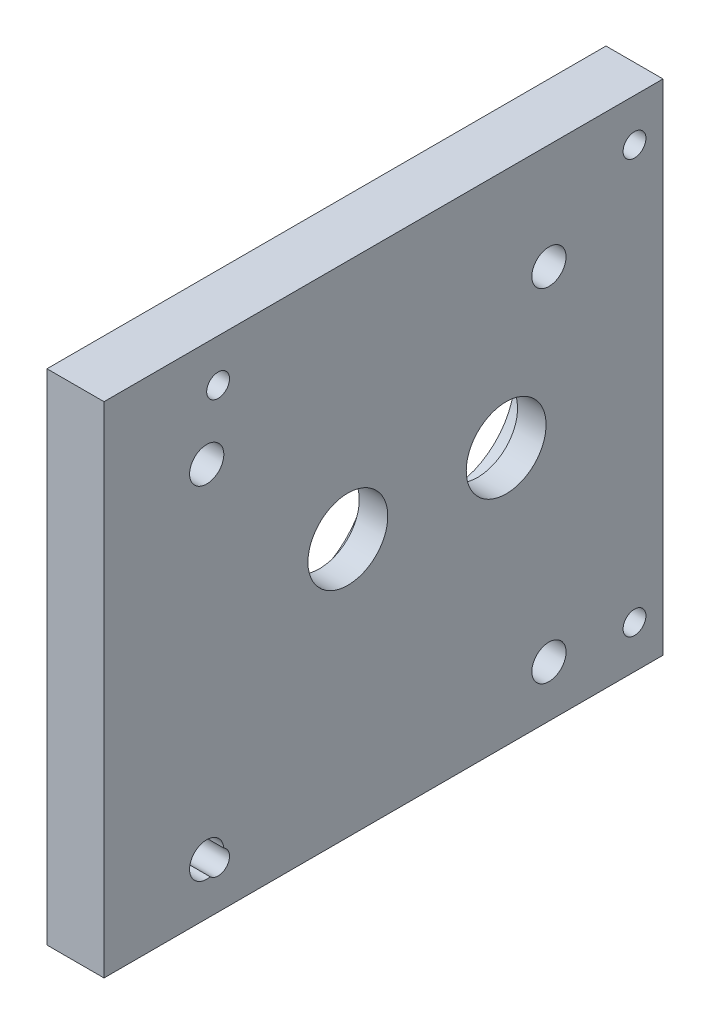
ISO-10303-21;
HEADER;
FILE_DESCRIPTION(('STEP AP214'),'2;1');
FILE_NAME('part.step','',(''),(''),'','','');
FILE_SCHEMA(('AUTOMOTIVE_DESIGN { 1 0 10303 214 1 1 1 1 }'));
ENDSEC;
DATA;
#1=APPLICATION_CONTEXT('core data for automotive mechanical design processes');
#2=APPLICATION_PROTOCOL_DEFINITION('international standard','automotive_design',2000,#1);
#3=PRODUCT_CONTEXT('',#1,'mechanical');
#4=PRODUCT('Part','Part','',(#3));
#5=PRODUCT_RELATED_PRODUCT_CATEGORY('part','',(#4));
#6=PRODUCT_DEFINITION_FORMATION('','',#4);
#7=PRODUCT_DEFINITION_CONTEXT('part definition',#1,'design');
#8=PRODUCT_DEFINITION('design','',#6,#7);
#9=PRODUCT_DEFINITION_SHAPE('','',#8);
#10=(LENGTH_UNIT() NAMED_UNIT(*) SI_UNIT(.MILLI.,.METRE.));
#11=(NAMED_UNIT(*) PLANE_ANGLE_UNIT() SI_UNIT($,.RADIAN.));
#12=(NAMED_UNIT(*) SI_UNIT($,.STERADIAN.) SOLID_ANGLE_UNIT());
#13=UNCERTAINTY_MEASURE_WITH_UNIT(LENGTH_MEASURE(1.E-05),#10,'distance_accuracy_value','');
#14=(GEOMETRIC_REPRESENTATION_CONTEXT(3) GLOBAL_UNCERTAINTY_ASSIGNED_CONTEXT((#13)) GLOBAL_UNIT_ASSIGNED_CONTEXT((#10,
#11,#12)) REPRESENTATION_CONTEXT('',''));
#15=CARTESIAN_POINT('',(0.,0.,0.));
#16=DIRECTION('',(0.,0.,1.));
#17=DIRECTION('',(1.,0.,0.));
#18=AXIS2_PLACEMENT_3D('',#15,#16,#17);
#19=CARTESIAN_POINT('',(-10.,175.,-98.));
#20=DIRECTION('',(1.,0.,0.));
#21=DIRECTION('',(0.,0.,-1.));
#22=AXIS2_PLACEMENT_3D('',#19,#20,#21);
#23=PLANE('',#22);
#24=CARTESIAN_POINT('',(-10.,138.,-58.));
#25=DIRECTION('',(-1.,0.,0.));
#26=DIRECTION('',(0.,0.,-1.));
#27=AXIS2_PLACEMENT_3D('',#24,#25,#26);
#28=CIRCLE('',#27,6.);
#29=CARTESIAN_POINT('',(-10.,138.,-64.));
#30=VERTEX_POINT('',#29);
#31=EDGE_CURVE('E219',#30,#30,#28,.T.);
#32=ORIENTED_EDGE('',*,*,#31,.F.);
#33=EDGE_LOOP('',(#32));
#34=FACE_BOUND('',#33,.T.);
#35=CARTESIAN_POINT('',(-10.,18.,-57.9999999999999));
#36=DIRECTION('',(-1.,0.,0.));
#37=DIRECTION('',(0.,0.,1.));
#38=AXIS2_PLACEMENT_3D('',#35,#36,#37);
#39=CIRCLE('',#38,6.);
#40=CARTESIAN_POINT('',(-10.,18.,-51.9999999999999));
#41=VERTEX_POINT('',#40);
#42=EDGE_CURVE('E223',#41,#41,#39,.T.);
#43=ORIENTED_EDGE('',*,*,#42,.F.);
#44=EDGE_LOOP('',(#43));
#45=FACE_BOUND('',#44,.T.);
#46=CARTESIAN_POINT('',(-10.,138.,62.));
#47=DIRECTION('',(-1.,0.,0.));
#48=DIRECTION('',(0.,0.,1.));
#49=AXIS2_PLACEMENT_3D('',#46,#47,#48);
#50=CIRCLE('',#49,6.);
#51=CARTESIAN_POINT('',(-10.,138.,68.));
#52=VERTEX_POINT('',#51);
#53=EDGE_CURVE('E227',#52,#52,#50,.T.);
#54=ORIENTED_EDGE('',*,*,#53,.F.);
#55=EDGE_LOOP('',(#54));
#56=FACE_BOUND('',#55,.T.);
#57=CARTESIAN_POINT('',(-10.,160.,58.0000000000001));
#58=DIRECTION('',(-1.,0.,0.));
#59=DIRECTION('',(0.,0.,1.));
#60=AXIS2_PLACEMENT_3D('',#57,#58,#59);
#61=CIRCLE('',#60,4.00000000000001);
#62=CARTESIAN_POINT('',(-10.,160.,62.0000000000001));
#63=VERTEX_POINT('',#62);
#64=EDGE_CURVE('E231',#63,#63,#61,.T.);
#65=ORIENTED_EDGE('',*,*,#64,.F.);
#66=EDGE_LOOP('',(#65));
#67=FACE_BOUND('',#66,.T.);
#68=CARTESIAN_POINT('',(-10.,160.,-88.));
#69=DIRECTION('',(-1.,0.,0.));
#70=DIRECTION('',(0.,0.,1.));
#71=AXIS2_PLACEMENT_3D('',#68,#69,#70);
#72=CIRCLE('',#71,4.00000000000001);
#73=CARTESIAN_POINT('',(-10.,160.,-83.9999999999999));
#74=VERTEX_POINT('',#73);
#75=EDGE_CURVE('E235',#74,#74,#72,.T.);
#76=ORIENTED_EDGE('',*,*,#75,.F.);
#77=EDGE_LOOP('',(#76));
#78=FACE_BOUND('',#77,.T.);
#79=CARTESIAN_POINT('',(-10.,15.,-88.));
#80=DIRECTION('',(-1.,0.,0.));
#81=DIRECTION('',(0.,0.,1.));
#82=AXIS2_PLACEMENT_3D('',#79,#80,#81);
#83=CIRCLE('',#82,4.00000000000001);
#84=CARTESIAN_POINT('',(-10.,15.,-83.9999999999999));
#85=VERTEX_POINT('',#84);
#86=EDGE_CURVE('E117',#85,#85,#83,.T.);
#87=ORIENTED_EDGE('',*,*,#86,.F.);
#88=EDGE_LOOP('',(#87));
#89=FACE_BOUND('',#88,.T.);
#90=CARTESIAN_POINT('',(-10.,15.,58.0000000000001));
#91=DIRECTION('',(-1.,0.,0.));
#92=DIRECTION('',(0.,0.,1.));
#93=AXIS2_PLACEMENT_3D('',#90,#91,#92);
#94=CIRCLE('',#93,4.00000000000001);
#95=CARTESIAN_POINT('',(-10.,18.4749015732775,56.0188238200419));
#96=VERTEX_POINT('',#95);
#97=CARTESIAN_POINT('',(-10.,12.1250984267225,60.7811761799582));
#98=VERTEX_POINT('',#97);
#99=EDGE_CURVE('E107',#96,#98,#94,.T.);
#100=ORIENTED_EDGE('',*,*,#99,.F.);
#101=CARTESIAN_POINT('',(-10.,18.,62.));
#102=DIRECTION('',(-1.,0.,0.));
#103=DIRECTION('',(0.,0.,-1.));
#104=AXIS2_PLACEMENT_3D('',#101,#102,#103);
#105=CIRCLE('',#104,6.);
#106=EDGE_CURVE('E98',#98,#96,#105,.T.);
#107=ORIENTED_EDGE('',*,*,#106,.F.);
#108=EDGE_LOOP('',(#100,#107));
#109=FACE_BOUND('',#108,.T.);
#110=CARTESIAN_POINT('',(-10.,90.5,12.5));
#111=DIRECTION('',(-1.,0.,0.));
#112=DIRECTION('',(0.,0.,1.));
#113=AXIS2_PLACEMENT_3D('',#110,#111,#112);
#114=CIRCLE('',#113,27.5);
#115=CARTESIAN_POINT('',(-10.,90.5,40.));
#116=VERTEX_POINT('',#115);
#117=EDGE_CURVE('E142',#116,#116,#114,.T.);
#118=ORIENTED_EDGE('',*,*,#117,.F.);
#119=EDGE_LOOP('',(#118));
#120=FACE_BOUND('',#119,.T.);
#121=CARTESIAN_POINT('',(-10.,90.5,-43.));
#122=DIRECTION('',(-1.,0.,0.));
#123=DIRECTION('',(0.,0.,1.));
#124=AXIS2_PLACEMENT_3D('',#121,#122,#123);
#125=CIRCLE('',#124,23.);
#126=CARTESIAN_POINT('',(-10.,90.5,-20.));
#127=VERTEX_POINT('',#126);
#128=EDGE_CURVE('E125',#127,#127,#125,.T.);
#129=ORIENTED_EDGE('',*,*,#128,.F.);
#130=EDGE_LOOP('',(#129));
#131=FACE_BOUND('',#130,.T.);
#132=DIRECTION('',(0.,0.,1.));
#133=VECTOR('',#132,1.);
#134=CARTESIAN_POINT('',(-10.,0.,-98.));
#135=LINE('',#134,#133);
#136=CARTESIAN_POINT('',(-10.,0.,-98.));
#137=VERTEX_POINT('',#136);
#138=CARTESIAN_POINT('',(-10.,0.,98.));
#139=VERTEX_POINT('',#138);
#140=EDGE_CURVE('E141',#137,#139,#135,.T.);
#141=ORIENTED_EDGE('',*,*,#140,.T.);
#142=DIRECTION('',(0.,-1.,0.));
#143=VECTOR('',#142,1.);
#144=CARTESIAN_POINT('',(-10.,175.,98.));
#145=LINE('',#144,#143);
#146=CARTESIAN_POINT('',(-10.,175.,98.));
#147=VERTEX_POINT('',#146);
#148=EDGE_CURVE('E103',#147,#139,#145,.T.);
#149=ORIENTED_EDGE('',*,*,#148,.F.);
#150=DIRECTION('',(0.,0.,1.));
#151=VECTOR('',#150,1.);
#152=CARTESIAN_POINT('',(-10.,175.,-98.));
#153=LINE('',#152,#151);
#154=CARTESIAN_POINT('',(-10.,175.,-98.));
#155=VERTEX_POINT('',#154);
#156=EDGE_CURVE('E153',#155,#147,#153,.T.);
#157=ORIENTED_EDGE('',*,*,#156,.F.);
#158=DIRECTION('',(0.,-1.,0.));
#159=VECTOR('',#158,1.);
#160=CARTESIAN_POINT('',(-10.,175.,-98.));
#161=LINE('',#160,#159);
#162=EDGE_CURVE('E163',#155,#137,#161,.T.);
#163=ORIENTED_EDGE('',*,*,#162,.T.);
#164=EDGE_LOOP('',(#141,#149,#157,#163));
#165=FACE_BOUND('',#164,.T.);
#166=ADVANCED_FACE('F37',(#34,#45,#56,#67,#78,#89,#109,#120,#131,#165),#23,.F.);
#167=CARTESIAN_POINT('',(-10.,175.,98.));
#168=DIRECTION('',(0.,0.,-1.));
#169=DIRECTION('',(-1.,0.,0.));
#170=AXIS2_PLACEMENT_3D('',#167,#168,#169);
#171=PLANE('',#170);
#172=DIRECTION('',(1.,0.,0.));
#173=VECTOR('',#172,1.);
#174=CARTESIAN_POINT('',(-10.,0.,98.));
#175=LINE('',#174,#173);
#176=CARTESIAN_POINT('',(10.,0.,98.));
#177=VERTEX_POINT('',#176);
#178=EDGE_CURVE('E167',#139,#177,#175,.T.);
#179=ORIENTED_EDGE('',*,*,#178,.T.);
#180=DIRECTION('',(0.,-1.,0.));
#181=VECTOR('',#180,1.);
#182=CARTESIAN_POINT('',(10.,175.,98.));
#183=LINE('',#182,#181);
#184=CARTESIAN_POINT('',(10.,175.,98.));
#185=VERTEX_POINT('',#184);
#186=EDGE_CURVE('E180',#185,#177,#183,.T.);
#187=ORIENTED_EDGE('',*,*,#186,.F.);
#188=DIRECTION('',(1.,0.,0.));
#189=VECTOR('',#188,1.);
#190=CARTESIAN_POINT('',(-10.,175.,98.));
#191=LINE('',#190,#189);
#192=EDGE_CURVE('E89',#147,#185,#191,.T.);
#193=ORIENTED_EDGE('',*,*,#192,.F.);
#194=ORIENTED_EDGE('',*,*,#148,.T.);
#195=EDGE_LOOP('',(#179,#187,#193,#194));
#196=FACE_BOUND('',#195,.T.);
#197=ADVANCED_FACE('F186',(#196),#171,.F.);
#198=CARTESIAN_POINT('',(9.99999999999998,175.,-98.));
#199=DIRECTION('',(-1.,0.,0.));
#200=DIRECTION('',(0.,0.,1.));
#201=AXIS2_PLACEMENT_3D('',#198,#199,#200);
#202=PLANE('',#201);
#203=CARTESIAN_POINT('',(10.0000000000001,138.,-58.));
#204=DIRECTION('',(-1.,0.,0.));
#205=DIRECTION('',(0.,0.,-1.));
#206=AXIS2_PLACEMENT_3D('',#203,#204,#205);
#207=CIRCLE('',#206,6.);
#208=CARTESIAN_POINT('',(10.0000000000001,138.,-64.));
#209=VERTEX_POINT('',#208);
#210=EDGE_CURVE('E108',#209,#209,#207,.T.);
#211=ORIENTED_EDGE('',*,*,#210,.T.);
#212=EDGE_LOOP('',(#211));
#213=FACE_BOUND('',#212,.T.);
#214=CARTESIAN_POINT('',(10.0000000000001,18.,-57.9999999999999));
#215=DIRECTION('',(-1.,0.,0.));
#216=DIRECTION('',(0.,0.,1.));
#217=AXIS2_PLACEMENT_3D('',#214,#215,#216);
#218=CIRCLE('',#217,6.);
#219=CARTESIAN_POINT('',(10.0000000000001,18.,-51.9999999999999));
#220=VERTEX_POINT('',#219);
#221=EDGE_CURVE('E256',#220,#220,#218,.T.);
#222=ORIENTED_EDGE('',*,*,#221,.T.);
#223=EDGE_LOOP('',(#222));
#224=FACE_BOUND('',#223,.T.);
#225=CARTESIAN_POINT('',(10.0000000000001,138.,62.));
#226=DIRECTION('',(-1.,0.,0.));
#227=DIRECTION('',(0.,0.,1.));
#228=AXIS2_PLACEMENT_3D('',#225,#226,#227);
#229=CIRCLE('',#228,6.);
#230=CARTESIAN_POINT('',(10.0000000000001,138.,68.));
#231=VERTEX_POINT('',#230);
#232=EDGE_CURVE('E248',#231,#231,#229,.T.);
#233=ORIENTED_EDGE('',*,*,#232,.T.);
#234=EDGE_LOOP('',(#233));
#235=FACE_BOUND('',#234,.T.);
#236=CARTESIAN_POINT('',(10.0000000000001,160.,58.));
#237=DIRECTION('',(-1.,0.,0.));
#238=DIRECTION('',(0.,0.,1.));
#239=AXIS2_PLACEMENT_3D('',#236,#237,#238);
#240=CIRCLE('',#239,4.00000000000001);
#241=CARTESIAN_POINT('',(10.0000000000001,160.,62.0000000000001));
#242=VERTEX_POINT('',#241);
#243=EDGE_CURVE('E246',#242,#242,#240,.T.);
#244=ORIENTED_EDGE('',*,*,#243,.T.);
#245=EDGE_LOOP('',(#244));
#246=FACE_BOUND('',#245,.T.);
#247=CARTESIAN_POINT('',(10.0000000000001,160.,-88.));
#248=DIRECTION('',(-1.,0.,0.));
#249=DIRECTION('',(0.,0.,1.));
#250=AXIS2_PLACEMENT_3D('',#247,#248,#249);
#251=CIRCLE('',#250,4.00000000000001);
#252=CARTESIAN_POINT('',(10.0000000000001,160.,-83.9999999999999));
#253=VERTEX_POINT('',#252);
#254=EDGE_CURVE('E239',#253,#253,#251,.T.);
#255=ORIENTED_EDGE('',*,*,#254,.T.);
#256=EDGE_LOOP('',(#255));
#257=FACE_BOUND('',#256,.T.);
#258=CARTESIAN_POINT('',(10.0000000000001,15.,-88.));
#259=DIRECTION('',(-1.,0.,0.));
#260=DIRECTION('',(0.,0.,1.));
#261=AXIS2_PLACEMENT_3D('',#258,#259,#260);
#262=CIRCLE('',#261,4.00000000000001);
#263=CARTESIAN_POINT('',(10.0000000000001,15.,-83.9999999999999));
#264=VERTEX_POINT('',#263);
#265=EDGE_CURVE('E112',#264,#264,#262,.T.);
#266=ORIENTED_EDGE('',*,*,#265,.T.);
#267=EDGE_LOOP('',(#266));
#268=FACE_BOUND('',#267,.T.);
#269=CARTESIAN_POINT('',(10.0000000000001,15.,58.));
#270=DIRECTION('',(-1.,0.,0.));
#271=DIRECTION('',(0.,0.,1.));
#272=AXIS2_PLACEMENT_3D('',#269,#270,#271);
#273=CIRCLE('',#272,4.00000000000001);
#274=CARTESIAN_POINT('',(10.0000000000001,18.4749015732775,56.0188238200419));
#275=VERTEX_POINT('',#274);
#276=CARTESIAN_POINT('',(10.0000000000001,12.1250984267225,60.7811761799582));
#277=VERTEX_POINT('',#276);
#278=EDGE_CURVE('E111',#275,#277,#273,.T.);
#279=ORIENTED_EDGE('',*,*,#278,.T.);
#280=CARTESIAN_POINT('',(10.0000000000001,18.,62.));
#281=DIRECTION('',(-1.,0.,0.));
#282=DIRECTION('',(0.,0.,-1.));
#283=AXIS2_PLACEMENT_3D('',#280,#281,#282);
#284=CIRCLE('',#283,6.);
#285=EDGE_CURVE('E51',#277,#275,#284,.T.);
#286=ORIENTED_EDGE('',*,*,#285,.T.);
#287=EDGE_LOOP('',(#279,#286));
#288=FACE_BOUND('',#287,.T.);
#289=CARTESIAN_POINT('',(10.,90.5,12.5));
#290=DIRECTION('',(-1.,0.,0.));
#291=DIRECTION('',(0.,0.,1.));
#292=AXIS2_PLACEMENT_3D('',#289,#290,#291);
#293=CIRCLE('',#292,14.);
#294=CARTESIAN_POINT('',(10.0000000000001,90.5,26.5));
#295=VERTEX_POINT('',#294);
#296=EDGE_CURVE('E121',#295,#295,#293,.T.);
#297=ORIENTED_EDGE('',*,*,#296,.T.);
#298=EDGE_LOOP('',(#297));
#299=FACE_BOUND('',#298,.T.);
#300=CARTESIAN_POINT('',(10.,90.5,-43.));
#301=DIRECTION('',(-1.,0.,0.));
#302=DIRECTION('',(0.,0.,1.));
#303=AXIS2_PLACEMENT_3D('',#300,#301,#302);
#304=CIRCLE('',#303,14.);
#305=CARTESIAN_POINT('',(10.,90.5,-29.));
#306=VERTEX_POINT('',#305);
#307=EDGE_CURVE('E130',#306,#306,#304,.T.);
#308=ORIENTED_EDGE('',*,*,#307,.T.);
#309=EDGE_LOOP('',(#308));
#310=FACE_BOUND('',#309,.T.);
#311=DIRECTION('',(0.,0.,-1.));
#312=VECTOR('',#311,1.);
#313=CARTESIAN_POINT('',(9.99999999999998,0.,-98.));
#314=LINE('',#313,#312);
#315=CARTESIAN_POINT('',(9.99999999999998,0.,-98.));
#316=VERTEX_POINT('',#315);
#317=EDGE_CURVE('E170',#177,#316,#314,.T.);
#318=ORIENTED_EDGE('',*,*,#317,.T.);
#319=DIRECTION('',(0.,-1.,0.));
#320=VECTOR('',#319,1.);
#321=CARTESIAN_POINT('',(9.99999999999998,175.,-98.));
#322=LINE('',#321,#320);
#323=CARTESIAN_POINT('',(9.99999999999998,175.,-98.));
#324=VERTEX_POINT('',#323);
#325=EDGE_CURVE('E177',#324,#316,#322,.T.);
#326=ORIENTED_EDGE('',*,*,#325,.F.);
#327=DIRECTION('',(0.,0.,-1.));
#328=VECTOR('',#327,1.);
#329=CARTESIAN_POINT('',(9.99999999999998,175.,-98.));
#330=LINE('',#329,#328);
#331=EDGE_CURVE('E158',#185,#324,#330,.T.);
#332=ORIENTED_EDGE('',*,*,#331,.F.);
#333=ORIENTED_EDGE('',*,*,#186,.T.);
#334=EDGE_LOOP('',(#318,#326,#332,#333));
#335=FACE_BOUND('',#334,.T.);
#336=ADVANCED_FACE('F195',(#213,#224,#235,#246,#257,#268,#288,#299,#310,#335),#202,.F.);
#337=CARTESIAN_POINT('',(-10.,175.,-98.));
#338=DIRECTION('',(0.,0.,1.));
#339=DIRECTION('',(1.,0.,0.));
#340=AXIS2_PLACEMENT_3D('',#337,#338,#339);
#341=PLANE('',#340);
#342=DIRECTION('',(-1.,0.,0.));
#343=VECTOR('',#342,1.);
#344=CARTESIAN_POINT('',(-10.,0.,-98.));
#345=LINE('',#344,#343);
#346=EDGE_CURVE('E81',#316,#137,#345,.T.);
#347=ORIENTED_EDGE('',*,*,#346,.T.);
#348=ORIENTED_EDGE('',*,*,#162,.F.);
#349=DIRECTION('',(-1.,0.,0.));
#350=VECTOR('',#349,1.);
#351=CARTESIAN_POINT('',(-10.,175.,-98.));
#352=LINE('',#351,#350);
#353=EDGE_CURVE('E60',#324,#155,#352,.T.);
#354=ORIENTED_EDGE('',*,*,#353,.F.);
#355=ORIENTED_EDGE('',*,*,#325,.T.);
#356=EDGE_LOOP('',(#347,#348,#354,#355));
#357=FACE_BOUND('',#356,.T.);
#358=ADVANCED_FACE('F197',(#357),#341,.F.);
#359=CARTESIAN_POINT('',(0.,175.,0.));
#360=DIRECTION('',(0.,1.,0.));
#361=DIRECTION('',(0.,0.,1.));
#362=AXIS2_PLACEMENT_3D('',#359,#360,#361);
#363=PLANE('',#362);
#364=ORIENTED_EDGE('',*,*,#156,.T.);
#365=ORIENTED_EDGE('',*,*,#192,.T.);
#366=ORIENTED_EDGE('',*,*,#331,.T.);
#367=ORIENTED_EDGE('',*,*,#353,.T.);
#368=EDGE_LOOP('',(#364,#365,#366,#367));
#369=FACE_BOUND('',#368,.T.);
#370=ADVANCED_FACE('F198',(#369),#363,.T.);
#371=CARTESIAN_POINT('',(0.,0.,0.));
#372=DIRECTION('',(0.,1.,0.));
#373=DIRECTION('',(0.,0.,1.));
#374=AXIS2_PLACEMENT_3D('',#371,#372,#373);
#375=PLANE('',#374);
#376=CARTESIAN_POINT('',(0.,0.,-65.));
#377=DIRECTION('',(0.,-1.,0.));
#378=DIRECTION('',(0.,0.,-1.));
#379=AXIS2_PLACEMENT_3D('',#376,#377,#378);
#380=CIRCLE('',#379,4.);
#381=CARTESIAN_POINT('',(0.,0.,-69.));
#382=VERTEX_POINT('',#381);
#383=EDGE_CURVE('E270',#382,#382,#380,.T.);
#384=ORIENTED_EDGE('',*,*,#383,.F.);
#385=EDGE_LOOP('',(#384));
#386=FACE_BOUND('',#385,.T.);
#387=CARTESIAN_POINT('',(0.,0.,35.));
#388=DIRECTION('',(0.,-1.,0.));
#389=DIRECTION('',(0.,0.,1.));
#390=AXIS2_PLACEMENT_3D('',#387,#388,#389);
#391=CIRCLE('',#390,4.);
#392=CARTESIAN_POINT('',(0.,0.,39.));
#393=VERTEX_POINT('',#392);
#394=EDGE_CURVE('E264',#393,#393,#391,.T.);
#395=ORIENTED_EDGE('',*,*,#394,.F.);
#396=EDGE_LOOP('',(#395));
#397=FACE_BOUND('',#396,.T.);
#398=ORIENTED_EDGE('',*,*,#140,.F.);
#399=ORIENTED_EDGE('',*,*,#346,.F.);
#400=ORIENTED_EDGE('',*,*,#317,.F.);
#401=ORIENTED_EDGE('',*,*,#178,.F.);
#402=EDGE_LOOP('',(#398,#399,#400,#401));
#403=FACE_BOUND('',#402,.T.);
#404=ADVANCED_FACE('F191',(#386,#397,#403),#375,.F.);
#405=CARTESIAN_POINT('',(0.,90.5,-43.));
#406=DIRECTION('',(-1.,0.,0.));
#407=DIRECTION('',(0.,0.,1.));
#408=AXIS2_PLACEMENT_3D('',#405,#406,#407);
#409=CYLINDRICAL_SURFACE('',#408,23.);
#410=CARTESIAN_POINT('',(0.,90.5,-43.));
#411=DIRECTION('',(-1.,0.,0.));
#412=DIRECTION('',(0.,0.,1.));
#413=AXIS2_PLACEMENT_3D('',#410,#411,#412);
#414=CIRCLE('',#413,23.);
#415=CARTESIAN_POINT('',(0.,90.5,-20.));
#416=VERTEX_POINT('',#415);
#417=EDGE_CURVE('E146',#416,#416,#414,.T.);
#418=ORIENTED_EDGE('',*,*,#417,.F.);
#419=EDGE_LOOP('',(#418));
#420=FACE_BOUND('',#419,.T.);
#421=ORIENTED_EDGE('',*,*,#128,.T.);
#422=EDGE_LOOP('',(#421));
#423=FACE_BOUND('',#422,.T.);
#424=ADVANCED_FACE('F206',(#420,#423),#409,.F.);
#425=CARTESIAN_POINT('',(0.,90.5,-43.));
#426=DIRECTION('',(-1.,0.,0.));
#427=DIRECTION('',(0.,0.,1.));
#428=AXIS2_PLACEMENT_3D('',#425,#426,#427);
#429=PLANE('',#428);
#430=CARTESIAN_POINT('',(0.,90.5,-43.));
#431=DIRECTION('',(-1.,0.,0.));
#432=DIRECTION('',(0.,0.,1.));
#433=AXIS2_PLACEMENT_3D('',#430,#431,#432);
#434=CIRCLE('',#433,14.);
#435=CARTESIAN_POINT('',(0.,90.5,-29.));
#436=VERTEX_POINT('',#435);
#437=EDGE_CURVE('E114',#436,#436,#434,.T.);
#438=ORIENTED_EDGE('',*,*,#437,.F.);
#439=EDGE_LOOP('',(#438));
#440=FACE_BOUND('',#439,.T.);
#441=ORIENTED_EDGE('',*,*,#417,.T.);
#442=EDGE_LOOP('',(#441));
#443=FACE_BOUND('',#442,.T.);
#444=ADVANCED_FACE('F341',(#440,#443),#429,.T.);
#445=CARTESIAN_POINT('',(0.,90.5,12.5));
#446=DIRECTION('',(-1.,0.,0.));
#447=DIRECTION('',(0.,0.,1.));
#448=AXIS2_PLACEMENT_3D('',#445,#446,#447);
#449=CYLINDRICAL_SURFACE('',#448,27.5);
#450=CARTESIAN_POINT('',(0.,90.5,12.5));
#451=DIRECTION('',(-1.,0.,0.));
#452=DIRECTION('',(0.,0.,1.));
#453=AXIS2_PLACEMENT_3D('',#450,#451,#452);
#454=CIRCLE('',#453,27.5);
#455=CARTESIAN_POINT('',(0.,90.5,40.));
#456=VERTEX_POINT('',#455);
#457=EDGE_CURVE('E137',#456,#456,#454,.T.);
#458=ORIENTED_EDGE('',*,*,#457,.F.);
#459=EDGE_LOOP('',(#458));
#460=FACE_BOUND('',#459,.T.);
#461=ORIENTED_EDGE('',*,*,#117,.T.);
#462=EDGE_LOOP('',(#461));
#463=FACE_BOUND('',#462,.T.);
#464=ADVANCED_FACE('F337',(#460,#463),#449,.F.);
#465=CARTESIAN_POINT('',(0.,90.5,12.5));
#466=DIRECTION('',(-1.,0.,0.));
#467=DIRECTION('',(0.,0.,1.));
#468=AXIS2_PLACEMENT_3D('',#465,#466,#467);
#469=PLANE('',#468);
#470=CARTESIAN_POINT('',(0.,90.5,12.5));
#471=DIRECTION('',(-1.,0.,0.));
#472=DIRECTION('',(0.,0.,1.));
#473=AXIS2_PLACEMENT_3D('',#470,#471,#472);
#474=CIRCLE('',#473,14.);
#475=CARTESIAN_POINT('',(0.,90.5,26.5));
#476=VERTEX_POINT('',#475);
#477=EDGE_CURVE('E126',#476,#476,#474,.T.);
#478=ORIENTED_EDGE('',*,*,#477,.F.);
#479=EDGE_LOOP('',(#478));
#480=FACE_BOUND('',#479,.T.);
#481=ORIENTED_EDGE('',*,*,#457,.T.);
#482=EDGE_LOOP('',(#481));
#483=FACE_BOUND('',#482,.T.);
#484=ADVANCED_FACE('F333',(#480,#483),#469,.T.);
#485=CARTESIAN_POINT('',(10.,90.5,-43.));
#486=DIRECTION('',(-1.,0.,0.));
#487=DIRECTION('',(0.,0.,1.));
#488=AXIS2_PLACEMENT_3D('',#485,#486,#487);
#489=CYLINDRICAL_SURFACE('',#488,14.);
#490=ORIENTED_EDGE('',*,*,#307,.F.);
#491=EDGE_LOOP('',(#490));
#492=FACE_BOUND('',#491,.T.);
#493=ORIENTED_EDGE('',*,*,#437,.T.);
#494=EDGE_LOOP('',(#493));
#495=FACE_BOUND('',#494,.T.);
#496=ADVANCED_FACE('F329',(#492,#495),#489,.F.);
#497=CARTESIAN_POINT('',(10.,90.5,12.5));
#498=DIRECTION('',(-1.,0.,0.));
#499=DIRECTION('',(0.,0.,1.));
#500=AXIS2_PLACEMENT_3D('',#497,#498,#499);
#501=CYLINDRICAL_SURFACE('',#500,14.);
#502=ORIENTED_EDGE('',*,*,#296,.F.);
#503=EDGE_LOOP('',(#502));
#504=FACE_BOUND('',#503,.T.);
#505=ORIENTED_EDGE('',*,*,#477,.T.);
#506=EDGE_LOOP('',(#505));
#507=FACE_BOUND('',#506,.T.);
#508=ADVANCED_FACE('F326',(#504,#507),#501,.F.);
#509=CARTESIAN_POINT('',(10.0000000000001,15.,58.));
#510=DIRECTION('',(-1.,0.,0.));
#511=DIRECTION('',(0.,0.,1.));
#512=AXIS2_PLACEMENT_3D('',#509,#510,#511);
#513=CYLINDRICAL_SURFACE('',#512,4.00000000000001);
#514=ORIENTED_EDGE('',*,*,#278,.F.);
#515=DIRECTION('',(-1.,0.,0.));
#516=VECTOR('',#515,1.);
#517=CARTESIAN_POINT('',(0.,18.4749015732775,56.0188238200419));
#518=LINE('',#517,#516);
#519=EDGE_CURVE('E11',#275,#96,#518,.T.);
#520=ORIENTED_EDGE('',*,*,#519,.T.);
#521=ORIENTED_EDGE('',*,*,#99,.T.);
#522=DIRECTION('',(-1.,0.,0.));
#523=VECTOR('',#522,1.);
#524=CARTESIAN_POINT('',(0.,12.1250984267225,60.7811761799582));
#525=LINE('',#524,#523);
#526=EDGE_CURVE('E44',#98,#277,#525,.F.);
#527=ORIENTED_EDGE('',*,*,#526,.T.);
#528=EDGE_LOOP('',(#514,#520,#521,#527));
#529=FACE_BOUND('',#528,.T.);
#530=ADVANCED_FACE('F110',(#529),#513,.F.);
#531=CARTESIAN_POINT('',(10.0000000000001,15.,-88.));
#532=DIRECTION('',(-1.,0.,0.));
#533=DIRECTION('',(0.,0.,1.));
#534=AXIS2_PLACEMENT_3D('',#531,#532,#533);
#535=CYLINDRICAL_SURFACE('',#534,4.00000000000001);
#536=ORIENTED_EDGE('',*,*,#265,.F.);
#537=EDGE_LOOP('',(#536));
#538=FACE_BOUND('',#537,.T.);
#539=ORIENTED_EDGE('',*,*,#86,.T.);
#540=EDGE_LOOP('',(#539));
#541=FACE_BOUND('',#540,.T.);
#542=ADVANCED_FACE('F313',(#538,#541),#535,.F.);
#543=CARTESIAN_POINT('',(10.0000000000001,160.,-88.));
#544=DIRECTION('',(-1.,0.,0.));
#545=DIRECTION('',(0.,0.,1.));
#546=AXIS2_PLACEMENT_3D('',#543,#544,#545);
#547=CYLINDRICAL_SURFACE('',#546,4.00000000000001);
#548=ORIENTED_EDGE('',*,*,#254,.F.);
#549=EDGE_LOOP('',(#548));
#550=FACE_BOUND('',#549,.T.);
#551=ORIENTED_EDGE('',*,*,#75,.T.);
#552=EDGE_LOOP('',(#551));
#553=FACE_BOUND('',#552,.T.);
#554=ADVANCED_FACE('F316',(#550,#553),#547,.F.);
#555=CARTESIAN_POINT('',(10.0000000000001,160.,58.));
#556=DIRECTION('',(-1.,0.,0.));
#557=DIRECTION('',(0.,0.,1.));
#558=AXIS2_PLACEMENT_3D('',#555,#556,#557);
#559=CYLINDRICAL_SURFACE('',#558,4.00000000000001);
#560=ORIENTED_EDGE('',*,*,#243,.F.);
#561=EDGE_LOOP('',(#560));
#562=FACE_BOUND('',#561,.T.);
#563=ORIENTED_EDGE('',*,*,#64,.T.);
#564=EDGE_LOOP('',(#563));
#565=FACE_BOUND('',#564,.T.);
#566=ADVANCED_FACE('F308',(#562,#565),#559,.F.);
#567=CARTESIAN_POINT('',(10.0000000000001,18.,62.));
#568=DIRECTION('',(-1.,0.,0.));
#569=DIRECTION('',(0.,0.,1.));
#570=AXIS2_PLACEMENT_3D('',#567,#568,#569);
#571=CYLINDRICAL_SURFACE('',#570,6.);
#572=ORIENTED_EDGE('',*,*,#285,.F.);
#573=ORIENTED_EDGE('',*,*,#526,.F.);
#574=ORIENTED_EDGE('',*,*,#106,.T.);
#575=ORIENTED_EDGE('',*,*,#519,.F.);
#576=EDGE_LOOP('',(#572,#573,#574,#575));
#577=FACE_BOUND('',#576,.T.);
#578=ADVANCED_FACE('F97',(#577),#571,.F.);
#579=CARTESIAN_POINT('',(10.0000000000001,138.,62.));
#580=DIRECTION('',(-1.,0.,0.));
#581=DIRECTION('',(0.,0.,1.));
#582=AXIS2_PLACEMENT_3D('',#579,#580,#581);
#583=CYLINDRICAL_SURFACE('',#582,6.);
#584=ORIENTED_EDGE('',*,*,#232,.F.);
#585=EDGE_LOOP('',(#584));
#586=FACE_BOUND('',#585,.T.);
#587=ORIENTED_EDGE('',*,*,#53,.T.);
#588=EDGE_LOOP('',(#587));
#589=FACE_BOUND('',#588,.T.);
#590=ADVANCED_FACE('F305',(#586,#589),#583,.F.);
#591=CARTESIAN_POINT('',(10.0000000000001,18.,-57.9999999999999));
#592=DIRECTION('',(-1.,0.,0.));
#593=DIRECTION('',(0.,0.,1.));
#594=AXIS2_PLACEMENT_3D('',#591,#592,#593);
#595=CYLINDRICAL_SURFACE('',#594,6.);
#596=ORIENTED_EDGE('',*,*,#221,.F.);
#597=EDGE_LOOP('',(#596));
#598=FACE_BOUND('',#597,.T.);
#599=ORIENTED_EDGE('',*,*,#42,.T.);
#600=EDGE_LOOP('',(#599));
#601=FACE_BOUND('',#600,.T.);
#602=ADVANCED_FACE('F298',(#598,#601),#595,.F.);
#603=CARTESIAN_POINT('',(10.0000000000001,138.,-58.));
#604=DIRECTION('',(-1.,0.,0.));
#605=DIRECTION('',(0.,0.,1.));
#606=AXIS2_PLACEMENT_3D('',#603,#604,#605);
#607=CYLINDRICAL_SURFACE('',#606,6.);
#608=ORIENTED_EDGE('',*,*,#210,.F.);
#609=EDGE_LOOP('',(#608));
#610=FACE_BOUND('',#609,.T.);
#611=ORIENTED_EDGE('',*,*,#31,.T.);
#612=EDGE_LOOP('',(#611));
#613=FACE_BOUND('',#612,.T.);
#614=ADVANCED_FACE('F289',(#610,#613),#607,.F.);
#615=CARTESIAN_POINT('',(0.,12.,35.));
#616=DIRECTION('',(0.,-1.,0.));
#617=DIRECTION('',(0.,0.,-1.));
#618=AXIS2_PLACEMENT_3D('',#615,#616,#617);
#619=CYLINDRICAL_SURFACE('',#618,4.);
#620=CARTESIAN_POINT('',(0.,12.,35.));
#621=DIRECTION('',(0.,-1.,0.));
#622=DIRECTION('',(0.,0.,1.));
#623=AXIS2_PLACEMENT_3D('',#620,#621,#622);
#624=CIRCLE('',#623,4.);
#625=CARTESIAN_POINT('',(0.,12.,39.));
#626=VERTEX_POINT('',#625);
#627=EDGE_CURVE('E267',#626,#626,#624,.T.);
#628=ORIENTED_EDGE('',*,*,#627,.F.);
#629=EDGE_LOOP('',(#628));
#630=FACE_BOUND('',#629,.T.);
#631=ORIENTED_EDGE('',*,*,#394,.T.);
#632=EDGE_LOOP('',(#631));
#633=FACE_BOUND('',#632,.T.);
#634=ADVANCED_FACE('F287',(#630,#633),#619,.F.);
#635=CARTESIAN_POINT('',(0.,12.,35.));
#636=DIRECTION('',(0.,1.,0.));
#637=DIRECTION('',(0.,0.,1.));
#638=AXIS2_PLACEMENT_3D('',#635,#636,#637);
#639=PLANE('',#638);
#640=ORIENTED_EDGE('',*,*,#627,.T.);
#641=EDGE_LOOP('',(#640));
#642=FACE_BOUND('',#641,.T.);
#643=ADVANCED_FACE('F281',(#642),#639,.F.);
#644=CARTESIAN_POINT('',(0.,12.,-65.));
#645=DIRECTION('',(0.,-1.,0.));
#646=DIRECTION('',(0.,0.,-1.));
#647=AXIS2_PLACEMENT_3D('',#644,#645,#646);
#648=CYLINDRICAL_SURFACE('',#647,4.);
#649=CARTESIAN_POINT('',(0.,12.,-65.));
#650=DIRECTION('',(0.,-1.,0.));
#651=DIRECTION('',(0.,0.,-1.));
#652=AXIS2_PLACEMENT_3D('',#649,#650,#651);
#653=CIRCLE('',#652,4.);
#654=CARTESIAN_POINT('',(0.,12.,-69.));
#655=VERTEX_POINT('',#654);
#656=EDGE_CURVE('E261',#655,#655,#653,.T.);
#657=ORIENTED_EDGE('',*,*,#656,.F.);
#658=EDGE_LOOP('',(#657));
#659=FACE_BOUND('',#658,.T.);
#660=ORIENTED_EDGE('',*,*,#383,.T.);
#661=EDGE_LOOP('',(#660));
#662=FACE_BOUND('',#661,.T.);
#663=ADVANCED_FACE('F278',(#659,#662),#648,.F.);
#664=CARTESIAN_POINT('',(0.,12.,-65.));
#665=DIRECTION('',(0.,-1.,0.));
#666=DIRECTION('',(0.,0.,-1.));
#667=AXIS2_PLACEMENT_3D('',#664,#665,#666);
#668=PLANE('',#667);
#669=ORIENTED_EDGE('',*,*,#656,.T.);
#670=EDGE_LOOP('',(#669));
#671=FACE_BOUND('',#670,.T.);
#672=ADVANCED_FACE('F276',(#671),#668,.T.);
#673=CLOSED_SHELL('',(#166,#197,#336,#358,#370,#404,#424,#444,#464,#484,#496,#508,#530,#542,
#554,#566,#578,#590,#602,#614,#634,#643,#663,#672));
#674=MANIFOLD_SOLID_BREP('B2',#673);
#675=ADVANCED_BREP_SHAPE_REPRESENTATION('',(#18,#674),#14);
#676=SHAPE_DEFINITION_REPRESENTATION(#9,#675);
ENDSEC;
END-ISO-10303-21;
